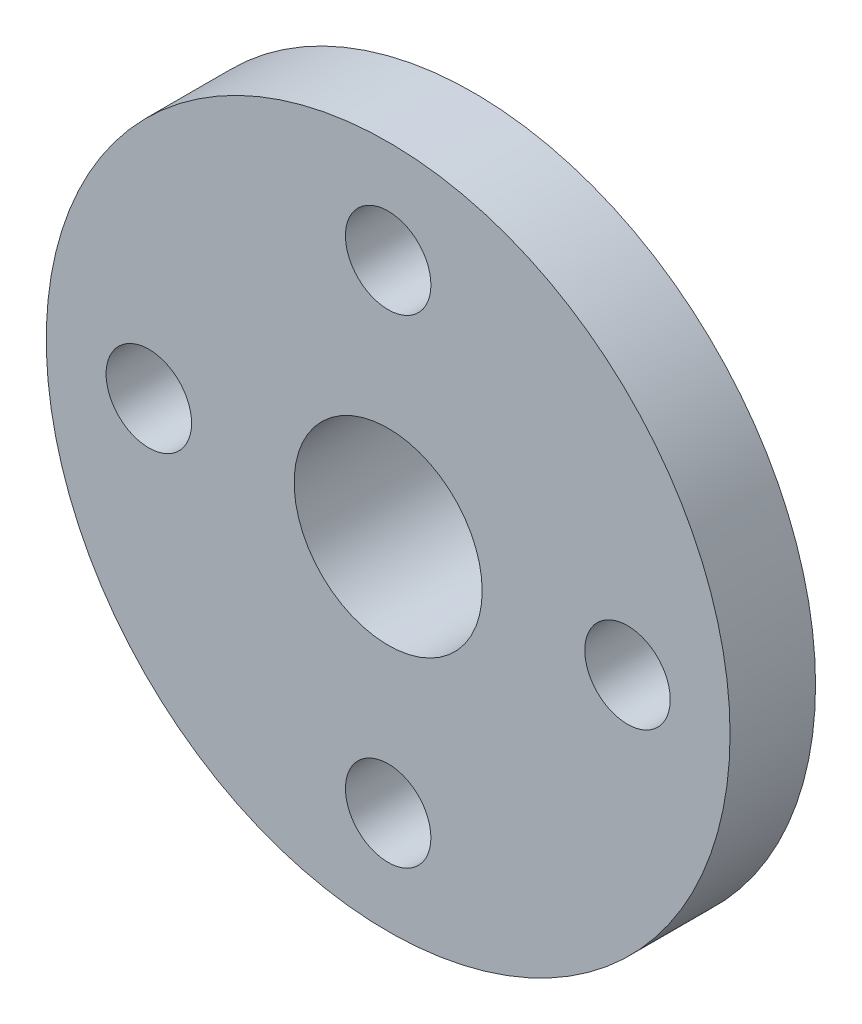
ISO-10303-21;
HEADER;
FILE_DESCRIPTION(('STEP AP214'),'2;1');
FILE_NAME('part.step','',(''),(''),'','','');
FILE_SCHEMA(('AUTOMOTIVE_DESIGN { 1 0 10303 214 1 1 1 1 }'));
ENDSEC;
DATA;
#1=APPLICATION_CONTEXT('core data for automotive mechanical design processes');
#2=APPLICATION_PROTOCOL_DEFINITION('international standard','automotive_design',2000,#1);
#3=PRODUCT_CONTEXT('',#1,'mechanical');
#4=PRODUCT('Part','Part','',(#3));
#5=PRODUCT_RELATED_PRODUCT_CATEGORY('part','',(#4));
#6=PRODUCT_DEFINITION_FORMATION('','',#4);
#7=PRODUCT_DEFINITION_CONTEXT('part definition',#1,'design');
#8=PRODUCT_DEFINITION('design','',#6,#7);
#9=PRODUCT_DEFINITION_SHAPE('','',#8);
#10=(LENGTH_UNIT() NAMED_UNIT(*) SI_UNIT(.MILLI.,.METRE.));
#11=(NAMED_UNIT(*) PLANE_ANGLE_UNIT() SI_UNIT($,.RADIAN.));
#12=(NAMED_UNIT(*) SI_UNIT($,.STERADIAN.) SOLID_ANGLE_UNIT());
#13=UNCERTAINTY_MEASURE_WITH_UNIT(LENGTH_MEASURE(1.E-05),#10,'distance_accuracy_value','');
#14=(GEOMETRIC_REPRESENTATION_CONTEXT(3) GLOBAL_UNCERTAINTY_ASSIGNED_CONTEXT((#13)) GLOBAL_UNIT_ASSIGNED_CONTEXT((#10,
#11,#12)) REPRESENTATION_CONTEXT('',''));
#15=CARTESIAN_POINT('',(0.,0.,0.));
#16=DIRECTION('',(0.,0.,1.));
#17=DIRECTION('',(1.,0.,0.));
#18=AXIS2_PLACEMENT_3D('',#15,#16,#17);
#19=CARTESIAN_POINT('',(12.5,0.,12.2));
#20=DIRECTION('',(0.,0.,1.));
#21=DIRECTION('',(1.,0.,0.));
#22=AXIS2_PLACEMENT_3D('',#19,#20,#21);
#23=PLANE('',#22);
#24=CARTESIAN_POINT('',(12.5,0.,12.2));
#25=DIRECTION('',(0.,0.,1.));
#26=DIRECTION('',(1.,0.,0.));
#27=AXIS2_PLACEMENT_3D('',#24,#25,#26);
#28=CIRCLE('',#27,5.5);
#29=CARTESIAN_POINT('',(18.,0.,12.2));
#30=VERTEX_POINT('',#29);
#31=EDGE_CURVE('E41',#30,#30,#28,.T.);
#32=ORIENTED_EDGE('',*,*,#31,.F.);
#33=EDGE_LOOP('',(#32));
#34=FACE_BOUND('',#33,.T.);
#35=CARTESIAN_POINT('',(12.5,0.,12.2));
#36=DIRECTION('',(0.,0.,1.));
#37=DIRECTION('',(1.,0.,0.));
#38=AXIS2_PLACEMENT_3D('',#35,#36,#37);
#39=CIRCLE('',#38,2.75);
#40=CARTESIAN_POINT('',(15.25,0.,12.2));
#41=VERTEX_POINT('',#40);
#42=EDGE_CURVE('E48',#41,#41,#39,.T.);
#43=ORIENTED_EDGE('',*,*,#42,.T.);
#44=EDGE_LOOP('',(#43));
#45=FACE_BOUND('',#44,.T.);
#46=ADVANCED_FACE('F40',(#34,#45),#23,.F.);
#47=CARTESIAN_POINT('',(12.5,0.,14.2));
#48=DIRECTION('',(0.,0.,-1.));
#49=DIRECTION('',(-1.,0.,0.));
#50=AXIS2_PLACEMENT_3D('',#47,#48,#49);
#51=CYLINDRICAL_SURFACE('',#50,5.5);
#52=CARTESIAN_POINT('',(12.5,0.,14.2));
#53=DIRECTION('',(0.,0.,1.));
#54=DIRECTION('',(1.,0.,0.));
#55=AXIS2_PLACEMENT_3D('',#52,#53,#54);
#56=CIRCLE('',#55,5.5);
#57=CARTESIAN_POINT('',(18.,0.,14.2));
#58=VERTEX_POINT('',#57);
#59=EDGE_CURVE('E10',#58,#58,#56,.T.);
#60=ORIENTED_EDGE('',*,*,#59,.F.);
#61=EDGE_LOOP('',(#60));
#62=FACE_BOUND('',#61,.T.);
#63=ORIENTED_EDGE('',*,*,#31,.T.);
#64=EDGE_LOOP('',(#63));
#65=FACE_BOUND('',#64,.T.);
#66=ADVANCED_FACE('F39',(#62,#65),#51,.T.);
#67=CARTESIAN_POINT('',(12.5,0.,14.2));
#68=DIRECTION('',(0.,0.,-1.));
#69=DIRECTION('',(-1.,0.,0.));
#70=AXIS2_PLACEMENT_3D('',#67,#68,#69);
#71=CYLINDRICAL_SURFACE('',#70,2.75);
#72=ORIENTED_EDGE('',*,*,#42,.F.);
#73=EDGE_LOOP('',(#72));
#74=FACE_BOUND('',#73,.T.);
#75=CARTESIAN_POINT('',(12.5,0.,16.7));
#76=DIRECTION('',(0.,0.,1.));
#77=DIRECTION('',(1.,0.,0.));
#78=AXIS2_PLACEMENT_3D('',#75,#76,#77);
#79=CIRCLE('',#78,2.75);
#80=CARTESIAN_POINT('',(15.25,0.,16.7));
#81=VERTEX_POINT('',#80);
#82=EDGE_CURVE('E57',#81,#81,#79,.T.);
#83=ORIENTED_EDGE('',*,*,#82,.T.);
#84=EDGE_LOOP('',(#83));
#85=FACE_BOUND('',#84,.T.);
#86=ADVANCED_FACE('F95',(#74,#85),#71,.F.);
#87=CARTESIAN_POINT('',(12.5,0.,16.7));
#88=DIRECTION('',(0.,0.,1.));
#89=DIRECTION('',(1.,0.,0.));
#90=AXIS2_PLACEMENT_3D('',#87,#88,#89);
#91=PLANE('',#90);
#92=CARTESIAN_POINT('',(12.5,7.,16.7));
#93=DIRECTION('',(0.,0.,1.));
#94=DIRECTION('',(1.,0.,0.));
#95=AXIS2_PLACEMENT_3D('',#92,#93,#94);
#96=CIRCLE('',#95,1.25);
#97=CARTESIAN_POINT('',(13.75,7.,16.7));
#98=VERTEX_POINT('',#97);
#99=EDGE_CURVE('E72',#98,#98,#96,.T.);
#100=ORIENTED_EDGE('',*,*,#99,.F.);
#101=EDGE_LOOP('',(#100));
#102=FACE_BOUND('',#101,.T.);
#103=CARTESIAN_POINT('',(19.5,0.,16.7));
#104=DIRECTION('',(0.,0.,1.));
#105=DIRECTION('',(1.,0.,0.));
#106=AXIS2_PLACEMENT_3D('',#103,#104,#105);
#107=CIRCLE('',#106,1.25);
#108=CARTESIAN_POINT('',(20.75,0.,16.7));
#109=VERTEX_POINT('',#108);
#110=EDGE_CURVE('E62',#109,#109,#107,.T.);
#111=ORIENTED_EDGE('',*,*,#110,.F.);
#112=EDGE_LOOP('',(#111));
#113=FACE_BOUND('',#112,.T.);
#114=CARTESIAN_POINT('',(12.5,0.,16.7));
#115=DIRECTION('',(0.,0.,1.));
#116=DIRECTION('',(1.,0.,0.));
#117=AXIS2_PLACEMENT_3D('',#114,#115,#116);
#118=CIRCLE('',#117,10.);
#119=CARTESIAN_POINT('',(22.5,0.,16.7));
#120=VERTEX_POINT('',#119);
#121=EDGE_CURVE('E55',#120,#120,#118,.T.);
#122=ORIENTED_EDGE('',*,*,#121,.T.);
#123=EDGE_LOOP('',(#122));
#124=FACE_BOUND('',#123,.T.);
#125=ORIENTED_EDGE('',*,*,#82,.F.);
#126=EDGE_LOOP('',(#125));
#127=FACE_BOUND('',#126,.T.);
#128=CARTESIAN_POINT('',(5.5,0.,16.7));
#129=DIRECTION('',(0.,0.,1.));
#130=DIRECTION('',(1.,0.,0.));
#131=AXIS2_PLACEMENT_3D('',#128,#129,#130);
#132=CIRCLE('',#131,1.25);
#133=CARTESIAN_POINT('',(6.75,0.,16.7));
#134=VERTEX_POINT('',#133);
#135=EDGE_CURVE('E63',#134,#134,#132,.T.);
#136=ORIENTED_EDGE('',*,*,#135,.F.);
#137=EDGE_LOOP('',(#136));
#138=FACE_BOUND('',#137,.T.);
#139=CARTESIAN_POINT('',(12.5,-7.,16.7));
#140=DIRECTION('',(0.,0.,1.));
#141=DIRECTION('',(1.,0.,0.));
#142=AXIS2_PLACEMENT_3D('',#139,#140,#141);
#143=CIRCLE('',#142,1.25);
#144=CARTESIAN_POINT('',(13.75,-7.,16.7));
#145=VERTEX_POINT('',#144);
#146=EDGE_CURVE('E80',#145,#145,#143,.T.);
#147=ORIENTED_EDGE('',*,*,#146,.F.);
#148=EDGE_LOOP('',(#147));
#149=FACE_BOUND('',#148,.T.);
#150=ADVANCED_FACE('F90',(#102,#113,#124,#127,#138,#149),#91,.T.);
#151=CARTESIAN_POINT('',(12.5,0.,14.2));
#152=DIRECTION('',(0.,0.,1.));
#153=DIRECTION('',(1.,0.,0.));
#154=AXIS2_PLACEMENT_3D('',#151,#152,#153);
#155=PLANE('',#154);
#156=ORIENTED_EDGE('',*,*,#59,.T.);
#157=EDGE_LOOP('',(#156));
#158=FACE_BOUND('',#157,.T.);
#159=CARTESIAN_POINT('',(12.5,0.,14.2));
#160=DIRECTION('',(0.,0.,1.));
#161=DIRECTION('',(1.,0.,0.));
#162=AXIS2_PLACEMENT_3D('',#159,#160,#161);
#163=CIRCLE('',#162,10.);
#164=CARTESIAN_POINT('',(22.5,0.,14.2));
#165=VERTEX_POINT('',#164);
#166=EDGE_CURVE('E52',#165,#165,#163,.T.);
#167=ORIENTED_EDGE('',*,*,#166,.F.);
#168=EDGE_LOOP('',(#167));
#169=FACE_BOUND('',#168,.T.);
#170=CARTESIAN_POINT('',(19.5,0.,14.2));
#171=DIRECTION('',(0.,0.,1.));
#172=DIRECTION('',(1.,0.,0.));
#173=AXIS2_PLACEMENT_3D('',#170,#171,#172);
#174=CIRCLE('',#173,1.25);
#175=CARTESIAN_POINT('',(20.75,0.,14.2));
#176=VERTEX_POINT('',#175);
#177=EDGE_CURVE('E65',#176,#176,#174,.T.);
#178=ORIENTED_EDGE('',*,*,#177,.T.);
#179=EDGE_LOOP('',(#178));
#180=FACE_BOUND('',#179,.T.);
#181=CARTESIAN_POINT('',(5.5,0.,14.2));
#182=DIRECTION('',(0.,0.,1.));
#183=DIRECTION('',(1.,0.,0.));
#184=AXIS2_PLACEMENT_3D('',#181,#182,#183);
#185=CIRCLE('',#184,1.25);
#186=CARTESIAN_POINT('',(6.75,0.,14.2));
#187=VERTEX_POINT('',#186);
#188=EDGE_CURVE('E67',#187,#187,#185,.T.);
#189=ORIENTED_EDGE('',*,*,#188,.T.);
#190=EDGE_LOOP('',(#189));
#191=FACE_BOUND('',#190,.T.);
#192=CARTESIAN_POINT('',(12.5,7.,14.2));
#193=DIRECTION('',(0.,0.,1.));
#194=DIRECTION('',(1.,0.,0.));
#195=AXIS2_PLACEMENT_3D('',#192,#193,#194);
#196=CIRCLE('',#195,1.25);
#197=CARTESIAN_POINT('',(13.75,7.,14.2));
#198=VERTEX_POINT('',#197);
#199=EDGE_CURVE('E74',#198,#198,#196,.T.);
#200=ORIENTED_EDGE('',*,*,#199,.T.);
#201=EDGE_LOOP('',(#200));
#202=FACE_BOUND('',#201,.T.);
#203=CARTESIAN_POINT('',(12.5,-7.,14.2));
#204=DIRECTION('',(0.,0.,1.));
#205=DIRECTION('',(1.,0.,0.));
#206=AXIS2_PLACEMENT_3D('',#203,#204,#205);
#207=CIRCLE('',#206,1.25);
#208=CARTESIAN_POINT('',(13.75,-7.,14.2));
#209=VERTEX_POINT('',#208);
#210=EDGE_CURVE('E78',#209,#209,#207,.T.);
#211=ORIENTED_EDGE('',*,*,#210,.T.);
#212=EDGE_LOOP('',(#211));
#213=FACE_BOUND('',#212,.T.);
#214=ADVANCED_FACE('F93',(#158,#169,#180,#191,#202,#213),#155,.F.);
#215=CARTESIAN_POINT('',(12.5,0.,16.7));
#216=DIRECTION('',(0.,0.,-1.));
#217=DIRECTION('',(-1.,0.,0.));
#218=AXIS2_PLACEMENT_3D('',#215,#216,#217);
#219=CYLINDRICAL_SURFACE('',#218,10.);
#220=ORIENTED_EDGE('',*,*,#121,.F.);
#221=EDGE_LOOP('',(#220));
#222=FACE_BOUND('',#221,.T.);
#223=ORIENTED_EDGE('',*,*,#166,.T.);
#224=EDGE_LOOP('',(#223));
#225=FACE_BOUND('',#224,.T.);
#226=ADVANCED_FACE('F97',(#222,#225),#219,.T.);
#227=CARTESIAN_POINT('',(19.5,0.,16.7));
#228=DIRECTION('',(0.,0.,-1.));
#229=DIRECTION('',(-1.,0.,0.));
#230=AXIS2_PLACEMENT_3D('',#227,#228,#229);
#231=CYLINDRICAL_SURFACE('',#230,1.25);
#232=ORIENTED_EDGE('',*,*,#110,.T.);
#233=EDGE_LOOP('',(#232));
#234=FACE_BOUND('',#233,.T.);
#235=ORIENTED_EDGE('',*,*,#177,.F.);
#236=EDGE_LOOP('',(#235));
#237=FACE_BOUND('',#236,.T.);
#238=ADVANCED_FACE('F117',(#234,#237),#231,.F.);
#239=CARTESIAN_POINT('',(5.5,0.,16.7));
#240=DIRECTION('',(0.,0.,-1.));
#241=DIRECTION('',(-1.,0.,0.));
#242=AXIS2_PLACEMENT_3D('',#239,#240,#241);
#243=CYLINDRICAL_SURFACE('',#242,1.25);
#244=ORIENTED_EDGE('',*,*,#135,.T.);
#245=EDGE_LOOP('',(#244));
#246=FACE_BOUND('',#245,.T.);
#247=ORIENTED_EDGE('',*,*,#188,.F.);
#248=EDGE_LOOP('',(#247));
#249=FACE_BOUND('',#248,.T.);
#250=ADVANCED_FACE('F121',(#246,#249),#243,.F.);
#251=CARTESIAN_POINT('',(12.5,7.,16.7));
#252=DIRECTION('',(0.,0.,-1.));
#253=DIRECTION('',(-1.,0.,0.));
#254=AXIS2_PLACEMENT_3D('',#251,#252,#253);
#255=CYLINDRICAL_SURFACE('',#254,1.25);
#256=ORIENTED_EDGE('',*,*,#99,.T.);
#257=EDGE_LOOP('',(#256));
#258=FACE_BOUND('',#257,.T.);
#259=ORIENTED_EDGE('',*,*,#199,.F.);
#260=EDGE_LOOP('',(#259));
#261=FACE_BOUND('',#260,.T.);
#262=ADVANCED_FACE('F136',(#258,#261),#255,.F.);
#263=CARTESIAN_POINT('',(12.5,-7.,16.7));
#264=DIRECTION('',(0.,0.,-1.));
#265=DIRECTION('',(-1.,0.,0.));
#266=AXIS2_PLACEMENT_3D('',#263,#264,#265);
#267=CYLINDRICAL_SURFACE('',#266,1.25);
#268=ORIENTED_EDGE('',*,*,#146,.T.);
#269=EDGE_LOOP('',(#268));
#270=FACE_BOUND('',#269,.T.);
#271=ORIENTED_EDGE('',*,*,#210,.F.);
#272=EDGE_LOOP('',(#271));
#273=FACE_BOUND('',#272,.T.);
#274=ADVANCED_FACE('F88',(#270,#273),#267,.F.);
#275=CLOSED_SHELL('',(#46,#66,#86,#150,#214,#226,#238,#250,#262,#274));
#276=MANIFOLD_SOLID_BREP('B2',#275);
#277=ADVANCED_BREP_SHAPE_REPRESENTATION('',(#18,#276),#14);
#278=SHAPE_DEFINITION_REPRESENTATION(#9,#277);
ENDSEC;
END-ISO-10303-21;
